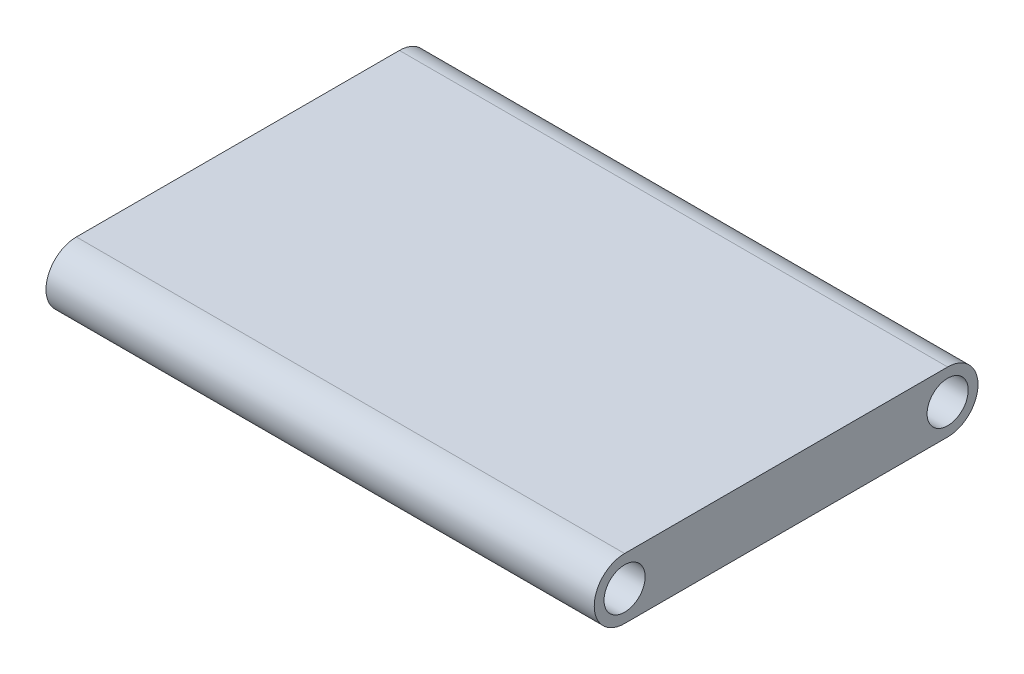
ISO-10303-21;
HEADER;
FILE_DESCRIPTION(('STEP AP214'),'2;1');
FILE_NAME('part.step','',(''),(''),'','','');
FILE_SCHEMA(('AUTOMOTIVE_DESIGN { 1 0 10303 214 1 1 1 1 }'));
ENDSEC;
DATA;
#1=APPLICATION_CONTEXT('core data for automotive mechanical design processes');
#2=APPLICATION_PROTOCOL_DEFINITION('international standard','automotive_design',2000,#1);
#3=PRODUCT_CONTEXT('',#1,'mechanical');
#4=PRODUCT('Part','Part','',(#3));
#5=PRODUCT_RELATED_PRODUCT_CATEGORY('part','',(#4));
#6=PRODUCT_DEFINITION_FORMATION('','',#4);
#7=PRODUCT_DEFINITION_CONTEXT('part definition',#1,'design');
#8=PRODUCT_DEFINITION('design','',#6,#7);
#9=PRODUCT_DEFINITION_SHAPE('','',#8);
#10=(LENGTH_UNIT() NAMED_UNIT(*) SI_UNIT(.MILLI.,.METRE.));
#11=(NAMED_UNIT(*) PLANE_ANGLE_UNIT() SI_UNIT($,.RADIAN.));
#12=(NAMED_UNIT(*) SI_UNIT($,.STERADIAN.) SOLID_ANGLE_UNIT());
#13=UNCERTAINTY_MEASURE_WITH_UNIT(LENGTH_MEASURE(1.E-05),#10,'distance_accuracy_value','');
#14=(GEOMETRIC_REPRESENTATION_CONTEXT(3) GLOBAL_UNCERTAINTY_ASSIGNED_CONTEXT((#13)) GLOBAL_UNIT_ASSIGNED_CONTEXT((#10,
#11,#12)) REPRESENTATION_CONTEXT('',''));
#15=CARTESIAN_POINT('',(0.,0.,0.));
#16=DIRECTION('',(0.,0.,1.));
#17=DIRECTION('',(1.,0.,0.));
#18=AXIS2_PLACEMENT_3D('',#15,#16,#17);
#19=CARTESIAN_POINT('',(0.,67.8334398571903,196.));
#20=DIRECTION('',(-1.,0.,0.));
#21=DIRECTION('',(0.,-1.,0.));
#22=AXIS2_PLACEMENT_3D('',#19,#20,#21);
#23=PLANE('',#22);
#24=CARTESIAN_POINT('',(0.,52.3334398571903,180.5));
#25=DIRECTION('',(1.,0.,0.));
#26=DIRECTION('',(0.,0.,-1.));
#27=AXIS2_PLACEMENT_3D('',#24,#25,#26);
#28=CIRCLE('',#27,10.5);
#29=CARTESIAN_POINT('',(0.,52.3334398571903,170.));
#30=VERTEX_POINT('',#29);
#31=EDGE_CURVE('E149',#30,#30,#28,.T.);
#32=ORIENTED_EDGE('',*,*,#31,.F.);
#33=EDGE_LOOP('',(#32));
#34=FACE_BOUND('',#33,.T.);
#35=CARTESIAN_POINT('',(0.,52.3334398571903,15.5));
#36=DIRECTION('',(1.,0.,0.));
#37=DIRECTION('',(0.,0.,-1.));
#38=AXIS2_PLACEMENT_3D('',#35,#36,#37);
#39=CIRCLE('',#38,10.5);
#40=CARTESIAN_POINT('',(0.,52.3334398571903,5.00000000000001));
#41=VERTEX_POINT('',#40);
#42=EDGE_CURVE('E141',#41,#41,#39,.T.);
#43=ORIENTED_EDGE('',*,*,#42,.F.);
#44=EDGE_LOOP('',(#43));
#45=FACE_BOUND('',#44,.T.);
#46=DIRECTION('',(0.,0.,-1.));
#47=VECTOR('',#46,1.);
#48=CARTESIAN_POINT('',(0.,67.8334398571903,196.));
#49=LINE('',#48,#47);
#50=CARTESIAN_POINT('',(0.,67.8334398571903,180.5));
#51=VERTEX_POINT('',#50);
#52=CARTESIAN_POINT('',(6.E-06,67.8334398571903,15.5));
#53=VERTEX_POINT('',#52);
#54=EDGE_CURVE('E11',#51,#53,#49,.T.);
#55=ORIENTED_EDGE('',*,*,#54,.F.);
#56=CARTESIAN_POINT('',(0.,52.3334398571903,180.5));
#57=DIRECTION('',(-1.,0.,0.));
#58=DIRECTION('',(0.,-1.,0.));
#59=AXIS2_PLACEMENT_3D('',#56,#57,#58);
#60=CIRCLE('',#59,15.5);
#61=CARTESIAN_POINT('',(6.E-06,36.8334398571903,180.5));
#62=VERTEX_POINT('',#61);
#63=EDGE_CURVE('E82',#51,#62,#60,.F.);
#64=ORIENTED_EDGE('',*,*,#63,.T.);
#65=DIRECTION('',(0.,0.,-1.));
#66=VECTOR('',#65,1.);
#67=CARTESIAN_POINT('',(0.,36.8334398571903,196.));
#68=LINE('',#67,#66);
#69=CARTESIAN_POINT('',(0.,36.8334398571903,15.5));
#70=VERTEX_POINT('',#69);
#71=EDGE_CURVE('E84',#62,#70,#68,.T.);
#72=ORIENTED_EDGE('',*,*,#71,.T.);
#73=CARTESIAN_POINT('',(0.,52.3334398571903,15.5));
#74=DIRECTION('',(-1.,0.,0.));
#75=DIRECTION('',(0.,-1.,0.));
#76=AXIS2_PLACEMENT_3D('',#73,#74,#75);
#77=CIRCLE('',#76,15.5);
#78=EDGE_CURVE('E63',#70,#53,#77,.F.);
#79=ORIENTED_EDGE('',*,*,#78,.T.);
#80=EDGE_LOOP('',(#55,#64,#72,#79));
#81=FACE_BOUND('',#80,.T.);
#82=ADVANCED_FACE('F39',(#34,#45,#81),#23,.F.);
#83=CARTESIAN_POINT('',(-280.,67.8334398571903,196.));
#84=DIRECTION('',(0.,-1.,0.));
#85=DIRECTION('',(0.,0.,-1.));
#86=AXIS2_PLACEMENT_3D('',#83,#84,#85);
#87=PLANE('',#86);
#88=DIRECTION('',(0.,0.,-1.));
#89=VECTOR('',#88,1.);
#90=CARTESIAN_POINT('',(-280.,67.8334398571903,196.));
#91=LINE('',#90,#89);
#92=CARTESIAN_POINT('',(-280.,67.8334398571903,180.5));
#93=VERTEX_POINT('',#92);
#94=CARTESIAN_POINT('',(-280.,67.8334398571903,15.5));
#95=VERTEX_POINT('',#94);
#96=EDGE_CURVE('E48',#93,#95,#91,.T.);
#97=ORIENTED_EDGE('',*,*,#96,.F.);
#98=DIRECTION('',(1.,0.,0.));
#99=VECTOR('',#98,1.);
#100=CARTESIAN_POINT('',(-280.,67.8334398571903,180.5));
#101=LINE('',#100,#99);
#102=EDGE_CURVE('E94',#93,#51,#101,.T.);
#103=ORIENTED_EDGE('',*,*,#102,.T.);
#104=ORIENTED_EDGE('',*,*,#54,.T.);
#105=DIRECTION('',(1.,0.,0.));
#106=VECTOR('',#105,1.);
#107=CARTESIAN_POINT('',(-280.,67.8334398571903,15.5));
#108=LINE('',#107,#106);
#109=EDGE_CURVE('E117',#95,#53,#108,.T.);
#110=ORIENTED_EDGE('',*,*,#109,.F.);
#111=EDGE_LOOP('',(#97,#103,#104,#110));
#112=FACE_BOUND('',#111,.T.);
#113=ADVANCED_FACE('F116',(#112),#87,.F.);
#114=CARTESIAN_POINT('',(-280.,36.8334398571903,196.));
#115=DIRECTION('',(1.,0.,0.));
#116=DIRECTION('',(0.,0.,-1.));
#117=AXIS2_PLACEMENT_3D('',#114,#115,#116);
#118=PLANE('',#117);
#119=DIRECTION('',(0.,0.,-1.));
#120=VECTOR('',#119,1.);
#121=CARTESIAN_POINT('',(-280.,36.8334398571903,196.));
#122=LINE('',#121,#120);
#123=CARTESIAN_POINT('',(-280.,36.8334398571903,180.5));
#124=VERTEX_POINT('',#123);
#125=CARTESIAN_POINT('',(-280.,36.8334398571903,15.5));
#126=VERTEX_POINT('',#125);
#127=EDGE_CURVE('E99',#124,#126,#122,.T.);
#128=ORIENTED_EDGE('',*,*,#127,.F.);
#129=CARTESIAN_POINT('',(-280.,52.3334398571903,180.5));
#130=DIRECTION('',(-1.,0.,0.));
#131=DIRECTION('',(0.,0.,-1.));
#132=AXIS2_PLACEMENT_3D('',#129,#130,#131);
#133=CIRCLE('',#132,15.5);
#134=EDGE_CURVE('E55',#124,#93,#133,.T.);
#135=ORIENTED_EDGE('',*,*,#134,.T.);
#136=ORIENTED_EDGE('',*,*,#96,.T.);
#137=CARTESIAN_POINT('',(-280.,52.3334398571903,15.5));
#138=DIRECTION('',(-1.,0.,0.));
#139=DIRECTION('',(0.,0.,1.));
#140=AXIS2_PLACEMENT_3D('',#137,#138,#139);
#141=CIRCLE('',#140,15.5);
#142=EDGE_CURVE('E113',#95,#126,#141,.T.);
#143=ORIENTED_EDGE('',*,*,#142,.T.);
#144=EDGE_LOOP('',(#128,#135,#136,#143));
#145=FACE_BOUND('',#144,.T.);
#146=ADVANCED_FACE('F112',(#145),#118,.F.);
#147=CARTESIAN_POINT('',(0.,36.8334398571903,196.));
#148=DIRECTION('',(0.,1.,0.));
#149=DIRECTION('',(-1.,0.,0.));
#150=AXIS2_PLACEMENT_3D('',#147,#148,#149);
#151=PLANE('',#150);
#152=ORIENTED_EDGE('',*,*,#71,.F.);
#153=DIRECTION('',(1.,0.,0.));
#154=VECTOR('',#153,1.);
#155=CARTESIAN_POINT('',(-280.,36.8334398571903,180.5));
#156=LINE('',#155,#154);
#157=EDGE_CURVE('E88',#124,#62,#156,.T.);
#158=ORIENTED_EDGE('',*,*,#157,.F.);
#159=ORIENTED_EDGE('',*,*,#127,.T.);
#160=DIRECTION('',(1.,0.,0.));
#161=VECTOR('',#160,1.);
#162=CARTESIAN_POINT('',(-280.,36.8334398571903,15.5));
#163=LINE('',#162,#161);
#164=EDGE_CURVE('E97',#126,#70,#163,.T.);
#165=ORIENTED_EDGE('',*,*,#164,.T.);
#166=EDGE_LOOP('',(#152,#158,#159,#165));
#167=FACE_BOUND('',#166,.T.);
#168=ADVANCED_FACE('F96',(#167),#151,.F.);
#169=CARTESIAN_POINT('',(-280.,52.3334398571903,15.5));
#170=DIRECTION('',(1.,0.,0.));
#171=DIRECTION('',(0.,0.,-1.));
#172=AXIS2_PLACEMENT_3D('',#169,#170,#171);
#173=CYLINDRICAL_SURFACE('',#172,15.5);
#174=ORIENTED_EDGE('',*,*,#164,.F.);
#175=ORIENTED_EDGE('',*,*,#142,.F.);
#176=ORIENTED_EDGE('',*,*,#109,.T.);
#177=ORIENTED_EDGE('',*,*,#78,.F.);
#178=EDGE_LOOP('',(#174,#175,#176,#177));
#179=FACE_BOUND('',#178,.T.);
#180=ADVANCED_FACE('F182',(#179),#173,.T.);
#181=CARTESIAN_POINT('',(-280.,52.3334398571903,180.5));
#182=DIRECTION('',(1.,0.,0.));
#183=DIRECTION('',(0.,0.,-1.));
#184=AXIS2_PLACEMENT_3D('',#181,#182,#183);
#185=CYLINDRICAL_SURFACE('',#184,15.5);
#186=ORIENTED_EDGE('',*,*,#102,.F.);
#187=ORIENTED_EDGE('',*,*,#134,.F.);
#188=ORIENTED_EDGE('',*,*,#157,.T.);
#189=ORIENTED_EDGE('',*,*,#63,.F.);
#190=EDGE_LOOP('',(#186,#187,#188,#189));
#191=FACE_BOUND('',#190,.T.);
#192=ADVANCED_FACE('F89',(#191),#185,.T.);
#193=CARTESIAN_POINT('',(-37.,52.3334398571903,15.5));
#194=DIRECTION('',(1.,0.,0.));
#195=DIRECTION('',(0.,0.,-1.));
#196=AXIS2_PLACEMENT_3D('',#193,#194,#195);
#197=CYLINDRICAL_SURFACE('',#196,10.5);
#198=CARTESIAN_POINT('',(-37.,52.3334398571903,15.5));
#199=DIRECTION('',(1.,0.,0.));
#200=DIRECTION('',(0.,0.,-1.));
#201=AXIS2_PLACEMENT_3D('',#198,#199,#200);
#202=CIRCLE('',#201,10.5);
#203=CARTESIAN_POINT('',(-37.,52.3334398571903,5.00000000000001));
#204=VERTEX_POINT('',#203);
#205=EDGE_CURVE('E145',#204,#204,#202,.T.);
#206=ORIENTED_EDGE('',*,*,#205,.F.);
#207=EDGE_LOOP('',(#206));
#208=FACE_BOUND('',#207,.T.);
#209=ORIENTED_EDGE('',*,*,#42,.T.);
#210=EDGE_LOOP('',(#209));
#211=FACE_BOUND('',#210,.T.);
#212=ADVANCED_FACE('F172',(#208,#211),#197,.F.);
#213=CARTESIAN_POINT('',(-37.,52.3334398571903,15.5));
#214=DIRECTION('',(1.,0.,0.));
#215=DIRECTION('',(0.,0.,-1.));
#216=AXIS2_PLACEMENT_3D('',#213,#214,#215);
#217=PLANE('',#216);
#218=ORIENTED_EDGE('',*,*,#205,.T.);
#219=EDGE_LOOP('',(#218));
#220=FACE_BOUND('',#219,.T.);
#221=ADVANCED_FACE('F164',(#220),#217,.T.);
#222=CARTESIAN_POINT('',(-37.,52.3334398571903,180.5));
#223=DIRECTION('',(1.,0.,0.));
#224=DIRECTION('',(0.,0.,-1.));
#225=AXIS2_PLACEMENT_3D('',#222,#223,#224);
#226=CYLINDRICAL_SURFACE('',#225,10.5);
#227=CARTESIAN_POINT('',(-37.,52.3334398571903,180.5));
#228=DIRECTION('',(1.,0.,0.));
#229=DIRECTION('',(0.,0.,-1.));
#230=AXIS2_PLACEMENT_3D('',#227,#228,#229);
#231=CIRCLE('',#230,10.5);
#232=CARTESIAN_POINT('',(-37.,52.3334398571903,170.));
#233=VERTEX_POINT('',#232);
#234=EDGE_CURVE('E153',#233,#233,#231,.T.);
#235=ORIENTED_EDGE('',*,*,#234,.F.);
#236=EDGE_LOOP('',(#235));
#237=FACE_BOUND('',#236,.T.);
#238=ORIENTED_EDGE('',*,*,#31,.T.);
#239=EDGE_LOOP('',(#238));
#240=FACE_BOUND('',#239,.T.);
#241=ADVANCED_FACE('F161',(#237,#240),#226,.F.);
#242=CARTESIAN_POINT('',(-37.,52.3334398571903,180.5));
#243=DIRECTION('',(1.,0.,0.));
#244=DIRECTION('',(0.,0.,-1.));
#245=AXIS2_PLACEMENT_3D('',#242,#243,#244);
#246=PLANE('',#245);
#247=ORIENTED_EDGE('',*,*,#234,.T.);
#248=EDGE_LOOP('',(#247));
#249=FACE_BOUND('',#248,.T.);
#250=ADVANCED_FACE('F159',(#249),#246,.T.);
#251=CLOSED_SHELL('',(#82,#113,#146,#168,#180,#192,#212,#221,#241,#250));
#252=MANIFOLD_SOLID_BREP('B2',#251);
#253=ADVANCED_BREP_SHAPE_REPRESENTATION('',(#18,#252),#14);
#254=SHAPE_DEFINITION_REPRESENTATION(#9,#253);
ENDSEC;
END-ISO-10303-21;
